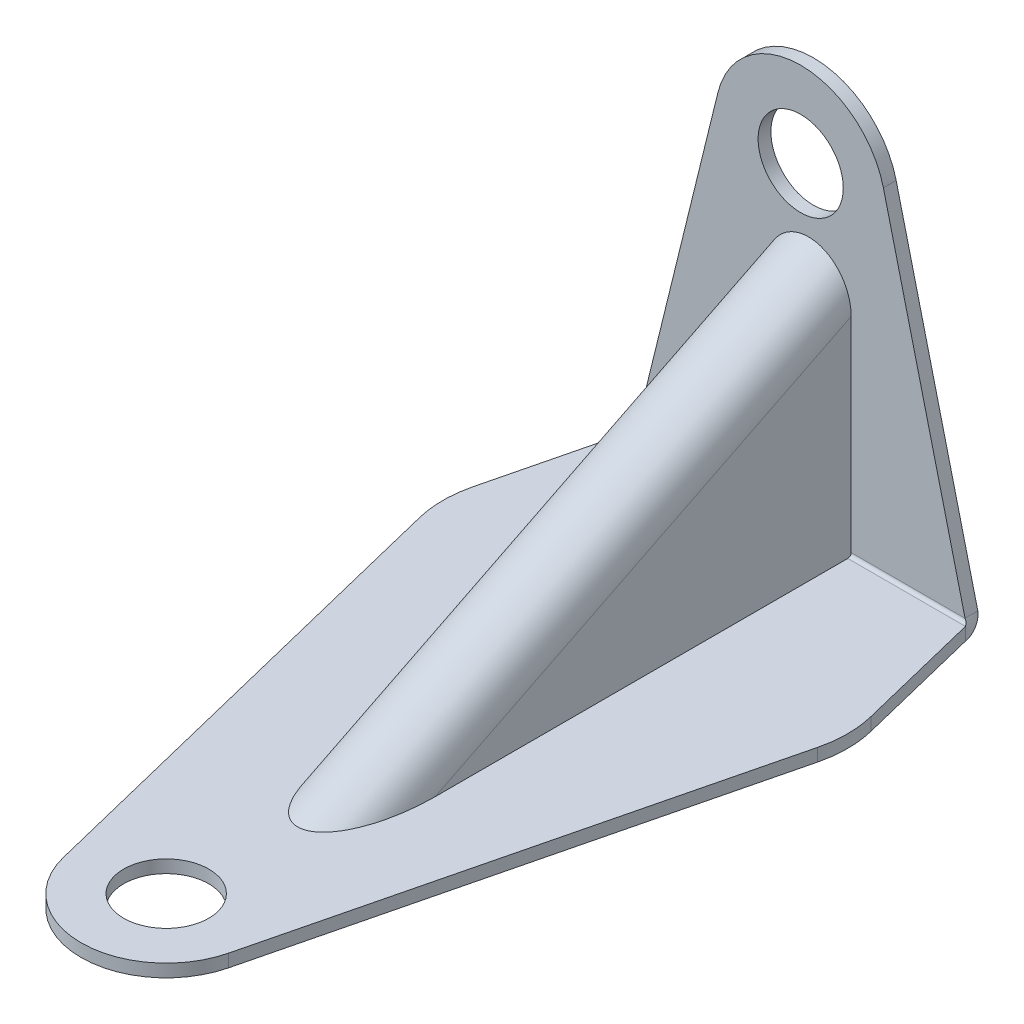
ISO-10303-21;
HEADER;
FILE_DESCRIPTION(('STEP AP214'),'2;1');
FILE_NAME('part.step','',(''),(''),'','','');
FILE_SCHEMA(('AUTOMOTIVE_DESIGN { 1 0 10303 214 1 1 1 1 }'));
ENDSEC;
DATA;
#1=APPLICATION_CONTEXT('core data for automotive mechanical design processes');
#2=APPLICATION_PROTOCOL_DEFINITION('international standard','automotive_design',2000,#1);
#3=PRODUCT_CONTEXT('',#1,'mechanical');
#4=PRODUCT('Part','Part','',(#3));
#5=PRODUCT_RELATED_PRODUCT_CATEGORY('part','',(#4));
#6=PRODUCT_DEFINITION_FORMATION('','',#4);
#7=PRODUCT_DEFINITION_CONTEXT('part definition',#1,'design');
#8=PRODUCT_DEFINITION('design','',#6,#7);
#9=PRODUCT_DEFINITION_SHAPE('','',#8);
#10=(LENGTH_UNIT() NAMED_UNIT(*) SI_UNIT(.MILLI.,.METRE.));
#11=(NAMED_UNIT(*) PLANE_ANGLE_UNIT() SI_UNIT($,.RADIAN.));
#12=(NAMED_UNIT(*) SI_UNIT($,.STERADIAN.) SOLID_ANGLE_UNIT());
#13=UNCERTAINTY_MEASURE_WITH_UNIT(LENGTH_MEASURE(1.E-05),#10,'distance_accuracy_value','');
#14=(GEOMETRIC_REPRESENTATION_CONTEXT(3) GLOBAL_UNCERTAINTY_ASSIGNED_CONTEXT((#13)) GLOBAL_UNIT_ASSIGNED_CONTEXT((#10,
#11,#12)) REPRESENTATION_CONTEXT('',''));
#15=CARTESIAN_POINT('',(0.,0.,0.));
#16=DIRECTION('',(0.,0.,1.));
#17=DIRECTION('',(1.,0.,0.));
#18=AXIS2_PLACEMENT_3D('',#15,#16,#17);
#19=CARTESIAN_POINT('',(0.,-35.5064157758141,-39.493584224186));
#20=DIRECTION('',(0.,0.,1.));
#21=DIRECTION('',(0.,-1.,0.));
#22=AXIS2_PLACEMENT_3D('',#19,#20,#21);
#23=PLANE('',#22);
#24=CARTESIAN_POINT('',(0.,76.9935842241859,-39.4935842241856));
#25=DIRECTION('',(0.,0.,1.));
#26=DIRECTION('',(0.,-1.,0.));
#27=AXIS2_PLACEMENT_3D('',#24,#25,#26);
#28=CIRCLE('',#27,10.);
#29=CARTESIAN_POINT('',(0.,66.9935842241859,-39.4935842241857));
#30=VERTEX_POINT('',#29);
#31=EDGE_CURVE('E598',#30,#30,#28,.F.);
#32=ORIENTED_EDGE('',*,*,#31,.F.);
#33=EDGE_LOOP('',(#32));
#34=FACE_BOUND('',#33,.T.);
#35=DIRECTION('',(0.,-1.,0.));
#36=VECTOR('',#35,1.);
#37=CARTESIAN_POINT('',(8.86383123235212,-35.5064157758141,-39.493584224186));
#38=LINE('',#37,#36);
#39=CARTESIAN_POINT('',(8.86383123235212,53.3196601125012,-39.4935842241857));
#40=VERTEX_POINT('',#39);
#41=CARTESIAN_POINT('',(8.86383123235213,3.80000000000002,-39.4935842241859));
#42=VERTEX_POINT('',#41);
#43=EDGE_CURVE('E228',#40,#42,#38,.T.);
#44=ORIENTED_EDGE('',*,*,#43,.F.);
#45=CARTESIAN_POINT('',(1.86383123235212,53.3196601125012,-39.4935842241857));
#46=DIRECTION('',(0.,0.,1.));
#47=DIRECTION('',(0.,-1.,0.));
#48=AXIS2_PLACEMENT_3D('',#45,#46,#47);
#49=ELLIPSE('',#48,7.82623792124925,7.);
#50=CARTESIAN_POINT('',(-5.13616876764788,53.3196601125012,-39.4935842241857));
#51=VERTEX_POINT('',#50);
#52=EDGE_CURVE('E230',#40,#51,#49,.T.);
#53=ORIENTED_EDGE('',*,*,#52,.T.);
#54=DIRECTION('',(0.,-1.,0.));
#55=VECTOR('',#54,1.);
#56=CARTESIAN_POINT('',(-5.13616876764788,-35.5064157758141,-39.493584224186));
#57=LINE('',#56,#55);
#58=CARTESIAN_POINT('',(-5.13616876764789,3.80000000000002,-39.4935842241859));
#59=VERTEX_POINT('',#58);
#60=EDGE_CURVE('E216',#51,#59,#57,.T.);
#61=ORIENTED_EDGE('',*,*,#60,.T.);
#62=DIRECTION('',(-1.,0.,0.));
#63=VECTOR('',#62,1.);
#64=CARTESIAN_POINT('',(0.,3.80000000000002,-39.4935842241859));
#65=LINE('',#64,#63);
#66=CARTESIAN_POINT('',(-38.6038312323521,3.80000000000002,-39.4935842241859));
#67=VERTEX_POINT('',#66);
#68=EDGE_CURVE('E429',#59,#67,#65,.T.);
#69=ORIENTED_EDGE('',*,*,#68,.T.);
#70=DIRECTION('',(-0.238900945490863,-0.971043942488481,0.));
#71=VECTOR('',#70,1.);
#72=CARTESIAN_POINT('',(-19.4208788497696,81.7716031340032,-39.4935842241856));
#73=LINE('',#72,#71);
#74=CARTESIAN_POINT('',(-19.4208788497696,81.7716031340032,-39.4935842241856));
#75=VERTEX_POINT('',#74);
#76=EDGE_CURVE('E518',#75,#67,#73,.T.);
#77=ORIENTED_EDGE('',*,*,#76,.F.);
#78=CARTESIAN_POINT('',(0.,76.9935842241859,-39.4935842241856));
#79=DIRECTION('',(0.,0.,1.));
#80=DIRECTION('',(0.,-1.,0.));
#81=AXIS2_PLACEMENT_3D('',#78,#79,#80);
#82=CIRCLE('',#81,20.);
#83=CARTESIAN_POINT('',(19.4208788497696,81.7716031340032,-39.4935842241856));
#84=VERTEX_POINT('',#83);
#85=EDGE_CURVE('E537',#84,#75,#82,.T.);
#86=ORIENTED_EDGE('',*,*,#85,.F.);
#87=DIRECTION('',(-0.238900945490863,0.971043942488481,0.));
#88=VECTOR('',#87,1.);
#89=CARTESIAN_POINT('',(19.4208788497696,81.7716031340032,-39.4935842241856));
#90=LINE('',#89,#88);
#91=CARTESIAN_POINT('',(38.6038312323521,3.80000000000002,-39.4935842241859));
#92=VERTEX_POINT('',#91);
#93=EDGE_CURVE('E534',#92,#84,#90,.T.);
#94=ORIENTED_EDGE('',*,*,#93,.F.);
#95=EDGE_CURVE('E447',#92,#42,#65,.T.);
#96=ORIENTED_EDGE('',*,*,#95,.T.);
#97=EDGE_LOOP('',(#44,#53,#61,#69,#77,#86,#94,#96));
#98=FACE_BOUND('',#97,.T.);
#99=ADVANCED_FACE('F68',(#34,#98),#23,.F.);
#100=CARTESIAN_POINT('',(0.,0.,0.));
#101=DIRECTION('',(0.,1.,0.));
#102=DIRECTION('',(0.,0.,1.));
#103=AXIS2_PLACEMENT_3D('',#100,#101,#102);
#104=PLANE('',#103);
#105=CARTESIAN_POINT('',(0.,0.,112.5));
#106=DIRECTION('',(0.,1.,0.));
#107=DIRECTION('',(0.,0.,1.));
#108=AXIS2_PLACEMENT_3D('',#105,#106,#107);
#109=CIRCLE('',#108,10.);
#110=CARTESIAN_POINT('',(0.,0.,122.5));
#111=VERTEX_POINT('',#110);
#112=EDGE_CURVE('E891',#111,#111,#109,.F.);
#113=ORIENTED_EDGE('',*,*,#112,.F.);
#114=EDGE_LOOP('',(#113));
#115=FACE_BOUND('',#114,.T.);
#116=DIRECTION('',(0.,0.,1.));
#117=VECTOR('',#116,1.);
#118=CARTESIAN_POINT('',(8.86383123235212,0.,0.));
#119=LINE('',#118,#117);
#120=CARTESIAN_POINT('',(8.86383123235213,0.,-35.6935842241859));
#121=VERTEX_POINT('',#120);
#122=CARTESIAN_POINT('',(8.86383123235212,0.,67.1457360008163));
#123=VERTEX_POINT('',#122);
#124=EDGE_CURVE('E223',#121,#123,#119,.T.);
#125=ORIENTED_EDGE('',*,*,#124,.F.);
#126=DIRECTION('',(-1.,0.,0.));
#127=VECTOR('',#126,1.);
#128=CARTESIAN_POINT('',(0.,0.,-35.6935842241859));
#129=LINE('',#128,#127);
#130=CARTESIAN_POINT('',(39.4926775922515,0.,-35.6935842241859));
#131=VERTEX_POINT('',#130);
#132=EDGE_CURVE('E412',#131,#121,#129,.T.);
#133=ORIENTED_EDGE('',*,*,#132,.F.);
#134=DIRECTION('',(-0.238900945490863,0.,-0.971043942488481));
#135=VECTOR('',#134,1.);
#136=CARTESIAN_POINT('',(19.4208788497696,0.,-117.278018909817));
#137=LINE('',#136,#135);
#138=CARTESIAN_POINT('',(46.7382293549642,0.,-6.24309739286439));
#139=VERTEX_POINT('',#138);
#140=EDGE_CURVE('E538',#139,#131,#137,.T.);
#141=ORIENTED_EDGE('',*,*,#140,.F.);
#142=CARTESIAN_POINT('',(0.,0.,0.));
#143=DIRECTION('',(0.,1.,0.));
#144=DIRECTION('',(1.,0.,0.));
#145=AXIS2_PLACEMENT_3D('',#142,#143,#144);
#146=ELLIPSE('',#145,47.5,35.);
#147=CARTESIAN_POINT('',(46.7382293549642,0.,6.24309739286439));
#148=VERTEX_POINT('',#147);
#149=EDGE_CURVE('E479',#148,#139,#146,.T.);
#150=ORIENTED_EDGE('',*,*,#149,.F.);
#151=DIRECTION('',(0.238900945490864,0.,-0.97104394248848));
#152=VECTOR('',#151,1.);
#153=CARTESIAN_POINT('',(19.4208788497696,0.,117.278018909817));
#154=LINE('',#153,#152);
#155=CARTESIAN_POINT('',(19.4208788497696,0.,117.278018909817));
#156=VERTEX_POINT('',#155);
#157=EDGE_CURVE('E487',#156,#148,#154,.T.);
#158=ORIENTED_EDGE('',*,*,#157,.F.);
#159=CARTESIAN_POINT('',(0.,0.,112.5));
#160=DIRECTION('',(0.,1.,0.));
#161=DIRECTION('',(0.,0.,1.));
#162=AXIS2_PLACEMENT_3D('',#159,#160,#161);
#163=CIRCLE('',#162,20.);
#164=CARTESIAN_POINT('',(-19.4208788497697,0.,117.278018909817));
#165=VERTEX_POINT('',#164);
#166=EDGE_CURVE('E613',#165,#156,#163,.T.);
#167=ORIENTED_EDGE('',*,*,#166,.F.);
#168=DIRECTION('',(0.238900945490862,0.,0.971043942488481));
#169=VECTOR('',#168,1.);
#170=CARTESIAN_POINT('',(-19.4208788497697,0.,117.278018909817));
#171=LINE('',#170,#169);
#172=CARTESIAN_POINT('',(-46.7382293549642,0.,6.24309739286432));
#173=VERTEX_POINT('',#172);
#174=EDGE_CURVE('E628',#173,#165,#171,.T.);
#175=ORIENTED_EDGE('',*,*,#174,.F.);
#176=CARTESIAN_POINT('',(0.,0.,0.));
#177=DIRECTION('',(0.,1.,0.));
#178=DIRECTION('',(1.,0.,0.));
#179=AXIS2_PLACEMENT_3D('',#176,#177,#178);
#180=ELLIPSE('',#179,47.5,35.);
#181=CARTESIAN_POINT('',(-46.7382293549642,0.,-6.24309739286437));
#182=VERTEX_POINT('',#181);
#183=EDGE_CURVE('E603',#182,#173,#180,.T.);
#184=ORIENTED_EDGE('',*,*,#183,.F.);
#185=DIRECTION('',(-0.238900945490863,0.,0.971043942488481));
#186=VECTOR('',#185,1.);
#187=CARTESIAN_POINT('',(-19.4208788497696,0.,-117.278018909817));
#188=LINE('',#187,#186);
#189=CARTESIAN_POINT('',(-39.4926775922515,0.,-35.6935842241859));
#190=VERTEX_POINT('',#189);
#191=EDGE_CURVE('E376',#190,#182,#188,.T.);
#192=ORIENTED_EDGE('',*,*,#191,.F.);
#193=CARTESIAN_POINT('',(-5.13616876764789,0.,-35.6935842241859));
#194=VERTEX_POINT('',#193);
#195=EDGE_CURVE('E221',#194,#190,#129,.T.);
#196=ORIENTED_EDGE('',*,*,#195,.F.);
#197=DIRECTION('',(0.,0.,1.));
#198=VECTOR('',#197,1.);
#199=CARTESIAN_POINT('',(-5.13616876764788,0.,0.));
#200=LINE('',#199,#198);
#201=CARTESIAN_POINT('',(-5.13616876764788,0.,67.1457360008163));
#202=VERTEX_POINT('',#201);
#203=EDGE_CURVE('E84',#194,#202,#200,.T.);
#204=ORIENTED_EDGE('',*,*,#203,.T.);
#205=CARTESIAN_POINT('',(1.86383123235212,0.,67.1457360008163));
#206=DIRECTION('',(0.,1.,0.));
#207=DIRECTION('',(0.,0.,1.));
#208=AXIS2_PLACEMENT_3D('',#205,#206,#207);
#209=ELLIPSE('',#208,15.6524758424985,7.);
#210=EDGE_CURVE('E13',#202,#123,#209,.T.);
#211=ORIENTED_EDGE('',*,*,#210,.T.);
#212=EDGE_LOOP('',(#125,#133,#141,#150,#158,#167,#175,#184,#192,#196,#204,#211));
#213=FACE_BOUND('',#212,.T.);
#214=ADVANCED_FACE('F219',(#115,#213),#104,.F.);
#215=CARTESIAN_POINT('',(79.1248310294722,3.8,-35.6935842241859));
#216=DIRECTION('',(-1.,0.,0.));
#217=DIRECTION('',(0.,0.,1.));
#218=AXIS2_PLACEMENT_3D('',#215,#216,#217);
#219=CYLINDRICAL_SURFACE('',#218,3.8);
#220=CARTESIAN_POINT('',(8.86383123235213,3.8,-35.6935842241859));
#221=DIRECTION('',(-1.,0.,0.));
#222=DIRECTION('',(0.,0.,1.));
#223=AXIS2_PLACEMENT_3D('',#220,#221,#222);
#224=CIRCLE('',#223,3.8);
#225=EDGE_CURVE('E77',#42,#121,#224,.T.);
#226=ORIENTED_EDGE('',*,*,#225,.F.);
#227=ORIENTED_EDGE('',*,*,#95,.F.);
#228=CARTESIAN_POINT('',(39.4926775922515,0.,-35.6935842241858));
#229=CARTESIAN_POINT('',(39.4185939972501,0.,-36.1910907987583));
#230=CARTESIAN_POINT('',(39.3445365322683,0.0989038286603866,-36.6882261847511));
#231=CARTESIAN_POINT('',(39.196395472285,0.4796117242538,-37.6073363495953));
#232=CARTESIAN_POINT('',(39.1223249422934,0.76126599888689,-38.0288617600905));
#233=CARTESIAN_POINT('',(38.9741838823102,1.4647224640953,-38.732318225299));
#234=CARTESIAN_POINT('',(38.9001133523186,1.88624787459057,-39.0139724999321));
#235=CARTESIAN_POINT('',(38.7519722923354,2.80535803943473,-39.3946803955255));
#236=CARTESIAN_POINT('',(38.6779148273535,3.30249342542754,-39.4935842241859));
#237=CARTESIAN_POINT('',(38.6038312323521,3.80000000000001,-39.4935842241859));
#238=B_SPLINE_CURVE_WITH_KNOTS('',3,(#228,#229,#230,#231,#232,#233,#234,#235,#236,#237),
.UNSPECIFIED.,.F.,.F.,(4,2,2,2,4),(0.,0.25,0.5,0.75,1.),.UNSPECIFIED.);
#239=EDGE_CURVE('E257',#131,#92,#238,.T.);
#240=ORIENTED_EDGE('',*,*,#239,.F.);
#241=ORIENTED_EDGE('',*,*,#132,.T.);
#242=EDGE_LOOP('',(#226,#227,#240,#241));
#243=FACE_BOUND('',#242,.T.);
#244=ADVANCED_FACE('F445',(#243),#219,.T.);
#245=CARTESIAN_POINT('',(0.,-35.5064157758141,-36.493584224186));
#246=DIRECTION('',(0.,0.,1.));
#247=DIRECTION('',(0.,-1.,0.));
#248=AXIS2_PLACEMENT_3D('',#245,#246,#247);
#249=PLANE('',#248);
#250=CARTESIAN_POINT('',(0.,76.9935842241859,-36.4935842241859));
#251=DIRECTION('',(0.,0.,1.));
#252=DIRECTION('',(1.,0.,0.));
#253=AXIS2_PLACEMENT_3D('',#250,#251,#252);
#254=CIRCLE('',#253,10.);
#255=CARTESIAN_POINT('',(10.,76.9935842241859,-36.4935842241859));
#256=VERTEX_POINT('',#255);
#257=EDGE_CURVE('E887',#256,#256,#254,.T.);
#258=ORIENTED_EDGE('',*,*,#257,.F.);
#259=EDGE_LOOP('',(#258));
#260=FACE_BOUND('',#259,.T.);
#261=CARTESIAN_POINT('',(1.86383123235212,51.8196601125012,-36.4935842241857));
#262=DIRECTION('',(0.,0.,1.));
#263=DIRECTION('',(0.,-1.,0.));
#264=AXIS2_PLACEMENT_3D('',#261,#262,#263);
#265=ELLIPSE('',#264,11.1803398874989,10.);
#266=CARTESIAN_POINT('',(11.8638312323521,51.8196601125012,-36.4935842241857));
#267=VERTEX_POINT('',#266);
#268=CARTESIAN_POINT('',(-8.13616876764788,51.8196601125012,-36.4935842241857));
#269=VERTEX_POINT('',#268);
#270=EDGE_CURVE('E92',#267,#269,#265,.T.);
#271=ORIENTED_EDGE('',*,*,#270,.F.);
#272=DIRECTION('',(0.,-1.,0.));
#273=VECTOR('',#272,1.);
#274=CARTESIAN_POINT('',(11.8638312323521,-35.5064157758141,-36.493584224186));
#275=LINE('',#274,#273);
#276=CARTESIAN_POINT('',(11.8638312323521,3.8,-36.4935842241859));
#277=VERTEX_POINT('',#276);
#278=EDGE_CURVE('E251',#267,#277,#275,.T.);
#279=ORIENTED_EDGE('',*,*,#278,.T.);
#280=DIRECTION('',(-1.,0.,0.));
#281=VECTOR('',#280,1.);
#282=CARTESIAN_POINT('',(0.,3.8,-36.4935842241859));
#283=LINE('',#282,#281);
#284=CARTESIAN_POINT('',(38.6038312323521,3.8,-36.4935842241859));
#285=VERTEX_POINT('',#284);
#286=EDGE_CURVE('E504',#285,#277,#283,.T.);
#287=ORIENTED_EDGE('',*,*,#286,.F.);
#288=DIRECTION('',(-0.238900945490863,0.971043942488481,0.));
#289=VECTOR('',#288,1.);
#290=CARTESIAN_POINT('',(19.4208788497696,81.7716031340031,-36.4935842241856));
#291=LINE('',#290,#289);
#292=CARTESIAN_POINT('',(19.4208788497696,81.7716031340031,-36.4935842241856));
#293=VERTEX_POINT('',#292);
#294=EDGE_CURVE('E514',#285,#293,#291,.T.);
#295=ORIENTED_EDGE('',*,*,#294,.T.);
#296=CARTESIAN_POINT('',(0.,76.9935842241859,-36.4935842241856));
#297=DIRECTION('',(0.,0.,1.));
#298=DIRECTION('',(0.,-1.,0.));
#299=AXIS2_PLACEMENT_3D('',#296,#297,#298);
#300=CIRCLE('',#299,20.);
#301=CARTESIAN_POINT('',(-19.4208788497696,81.7716031340032,-36.4935842241856));
#302=VERTEX_POINT('',#301);
#303=EDGE_CURVE('E517',#293,#302,#300,.T.);
#304=ORIENTED_EDGE('',*,*,#303,.T.);
#305=DIRECTION('',(-0.238900945490863,-0.971043942488481,0.));
#306=VECTOR('',#305,1.);
#307=CARTESIAN_POINT('',(-19.4208788497696,81.7716031340031,-36.4935842241856));
#308=LINE('',#307,#306);
#309=CARTESIAN_POINT('',(-38.6038312323521,3.8,-36.4935842241859));
#310=VERTEX_POINT('',#309);
#311=EDGE_CURVE('E549',#302,#310,#308,.T.);
#312=ORIENTED_EDGE('',*,*,#311,.T.);
#313=CARTESIAN_POINT('',(-8.13616876764788,3.8,-36.4935842241859));
#314=VERTEX_POINT('',#313);
#315=EDGE_CURVE('E501',#314,#310,#283,.T.);
#316=ORIENTED_EDGE('',*,*,#315,.F.);
#317=DIRECTION('',(0.,-1.,0.));
#318=VECTOR('',#317,1.);
#319=CARTESIAN_POINT('',(-8.13616876764788,-35.5064157758141,-36.493584224186));
#320=LINE('',#319,#318);
#321=EDGE_CURVE('E244',#269,#314,#320,.T.);
#322=ORIENTED_EDGE('',*,*,#321,.F.);
#323=EDGE_LOOP('',(#271,#279,#287,#295,#304,#312,#316,#322));
#324=FACE_BOUND('',#323,.T.);
#325=ADVANCED_FACE('F397',(#260,#324),#249,.T.);
#326=CARTESIAN_POINT('',(0.,3.,0.));
#327=DIRECTION('',(0.,1.,0.));
#328=DIRECTION('',(0.,0.,1.));
#329=AXIS2_PLACEMENT_3D('',#326,#327,#328);
#330=PLANE('',#329);
#331=CARTESIAN_POINT('',(0.,3.,112.5));
#332=DIRECTION('',(0.,1.,0.));
#333=DIRECTION('',(0.,0.,1.));
#334=AXIS2_PLACEMENT_3D('',#331,#332,#333);
#335=CIRCLE('',#334,10.);
#336=CARTESIAN_POINT('',(0.,3.,122.5));
#337=VERTEX_POINT('',#336);
#338=EDGE_CURVE('E888',#337,#337,#335,.T.);
#339=ORIENTED_EDGE('',*,*,#338,.F.);
#340=EDGE_LOOP('',(#339));
#341=FACE_BOUND('',#340,.T.);
#342=DIRECTION('',(-1.,0.,0.));
#343=VECTOR('',#342,1.);
#344=CARTESIAN_POINT('',(0.,3.,-35.6935842241859));
#345=LINE('',#344,#343);
#346=CARTESIAN_POINT('',(39.4926775922515,3.,-35.6935842241859));
#347=VERTEX_POINT('',#346);
#348=CARTESIAN_POINT('',(11.8638312323521,3.,-35.6935842241859));
#349=VERTEX_POINT('',#348);
#350=EDGE_CURVE('E492',#347,#349,#345,.T.);
#351=ORIENTED_EDGE('',*,*,#350,.T.);
#352=DIRECTION('',(0.,0.,1.));
#353=VECTOR('',#352,1.);
#354=CARTESIAN_POINT('',(11.8638312323521,3.,0.));
#355=LINE('',#354,#353);
#356=CARTESIAN_POINT('',(11.8638312323521,3.,61.1457360008163));
#357=VERTEX_POINT('',#356);
#358=EDGE_CURVE('E249',#349,#357,#355,.T.);
#359=ORIENTED_EDGE('',*,*,#358,.T.);
#360=CARTESIAN_POINT('',(1.86383123235212,3.,61.1457360008163));
#361=DIRECTION('',(0.,1.,0.));
#362=DIRECTION('',(0.,0.,1.));
#363=AXIS2_PLACEMENT_3D('',#360,#361,#362);
#364=ELLIPSE('',#363,22.3606797749978,10.);
#365=CARTESIAN_POINT('',(-8.13616876764788,3.,61.1457360008163));
#366=VERTEX_POINT('',#365);
#367=EDGE_CURVE('E253',#366,#357,#364,.T.);
#368=ORIENTED_EDGE('',*,*,#367,.F.);
#369=DIRECTION('',(0.,0.,1.));
#370=VECTOR('',#369,1.);
#371=CARTESIAN_POINT('',(-8.13616876764788,3.,0.));
#372=LINE('',#371,#370);
#373=CARTESIAN_POINT('',(-8.13616876764788,3.,-35.6935842241859));
#374=VERTEX_POINT('',#373);
#375=EDGE_CURVE('E241',#374,#366,#372,.T.);
#376=ORIENTED_EDGE('',*,*,#375,.F.);
#377=CARTESIAN_POINT('',(-39.4926775922515,3.,-35.6935842241859));
#378=VERTEX_POINT('',#377);
#379=EDGE_CURVE('E496',#374,#378,#345,.T.);
#380=ORIENTED_EDGE('',*,*,#379,.T.);
#381=DIRECTION('',(-0.238900945490863,0.,0.971043942488481));
#382=VECTOR('',#381,1.);
#383=CARTESIAN_POINT('',(-19.4208788497696,3.,-117.278018909817));
#384=LINE('',#383,#382);
#385=CARTESIAN_POINT('',(-46.7382293549642,3.,-6.24309739286437));
#386=VERTEX_POINT('',#385);
#387=EDGE_CURVE('E382',#378,#386,#384,.T.);
#388=ORIENTED_EDGE('',*,*,#387,.T.);
#389=CARTESIAN_POINT('',(0.,3.,0.));
#390=DIRECTION('',(0.,1.,0.));
#391=DIRECTION('',(1.,0.,0.));
#392=AXIS2_PLACEMENT_3D('',#389,#390,#391);
#393=ELLIPSE('',#392,47.5,35.);
#394=CARTESIAN_POINT('',(-46.7382293549642,3.,6.24309739286432));
#395=VERTEX_POINT('',#394);
#396=EDGE_CURVE('E378',#386,#395,#393,.T.);
#397=ORIENTED_EDGE('',*,*,#396,.T.);
#398=DIRECTION('',(0.238900945490862,0.,0.971043942488481));
#399=VECTOR('',#398,1.);
#400=CARTESIAN_POINT('',(-19.4208788497697,3.,117.278018909817));
#401=LINE('',#400,#399);
#402=CARTESIAN_POINT('',(-19.4208788497697,3.,117.278018909817));
#403=VERTEX_POINT('',#402);
#404=EDGE_CURVE('E381',#395,#403,#401,.T.);
#405=ORIENTED_EDGE('',*,*,#404,.T.);
#406=CARTESIAN_POINT('',(0.,3.,112.5));
#407=DIRECTION('',(0.,1.,0.));
#408=DIRECTION('',(0.,0.,1.));
#409=AXIS2_PLACEMENT_3D('',#406,#407,#408);
#410=CIRCLE('',#409,20.);
#411=CARTESIAN_POINT('',(19.4208788497696,3.,117.278018909817));
#412=VERTEX_POINT('',#411);
#413=EDGE_CURVE('E638',#403,#412,#410,.T.);
#414=ORIENTED_EDGE('',*,*,#413,.T.);
#415=DIRECTION('',(0.238900945490864,0.,-0.97104394248848));
#416=VECTOR('',#415,1.);
#417=CARTESIAN_POINT('',(19.4208788497696,3.,117.278018909817));
#418=LINE('',#417,#416);
#419=CARTESIAN_POINT('',(46.7382293549642,3.,6.24309739286439));
#420=VERTEX_POINT('',#419);
#421=EDGE_CURVE('E377',#412,#420,#418,.T.);
#422=ORIENTED_EDGE('',*,*,#421,.T.);
#423=CARTESIAN_POINT('',(0.,3.,0.));
#424=DIRECTION('',(0.,1.,0.));
#425=DIRECTION('',(1.,0.,0.));
#426=AXIS2_PLACEMENT_3D('',#423,#424,#425);
#427=ELLIPSE('',#426,47.5,35.);
#428=CARTESIAN_POINT('',(46.7382293549642,3.,-6.24309739286439));
#429=VERTEX_POINT('',#428);
#430=EDGE_CURVE('E368',#420,#429,#427,.T.);
#431=ORIENTED_EDGE('',*,*,#430,.T.);
#432=DIRECTION('',(-0.238900945490863,0.,-0.971043942488481));
#433=VECTOR('',#432,1.);
#434=CARTESIAN_POINT('',(19.4208788497696,3.,-117.278018909817));
#435=LINE('',#434,#433);
#436=EDGE_CURVE('E500',#429,#347,#435,.T.);
#437=ORIENTED_EDGE('',*,*,#436,.T.);
#438=EDGE_LOOP('',(#351,#359,#368,#376,#380,#388,#397,#405,#414,#422,#431,#437));
#439=FACE_BOUND('',#438,.T.);
#440=ADVANCED_FACE('F394',(#341,#439),#330,.T.);
#441=CARTESIAN_POINT('',(79.1248310294722,3.8,-35.6935842241859));
#442=DIRECTION('',(-1.,0.,0.));
#443=DIRECTION('',(0.,0.,1.));
#444=AXIS2_PLACEMENT_3D('',#441,#442,#443);
#445=CYLINDRICAL_SURFACE('',#444,0.8);
#446=ORIENTED_EDGE('',*,*,#286,.T.);
#447=CARTESIAN_POINT('',(11.8638312323521,3.8,-35.6935842241859));
#448=DIRECTION('',(-1.,0.,0.));
#449=DIRECTION('',(0.,0.,1.));
#450=AXIS2_PLACEMENT_3D('',#447,#448,#449);
#451=CIRCLE('',#450,0.8);
#452=EDGE_CURVE('E247',#277,#349,#451,.T.);
#453=ORIENTED_EDGE('',*,*,#452,.T.);
#454=ORIENTED_EDGE('',*,*,#350,.F.);
#455=CARTESIAN_POINT('',(38.6038312323521,3.8,-36.4935842241859));
#456=CARTESIAN_POINT('',(38.6779106636851,3.69526766030339,-36.4935842241859));
#457=CARTESIAN_POINT('',(38.7519722923354,3.59060169251258,-36.4727623655205));
#458=CARTESIAN_POINT('',(38.9001133523186,3.39710481570328,-36.3926133348693));
#459=CARTESIAN_POINT('',(38.9741838823102,3.30836262402006,-36.3333176981044));
#460=CARTESIAN_POINT('',(39.1223249422934,3.16026652608145,-36.1852216001658));
#461=CARTESIAN_POINT('',(39.196395472285,3.10097088931659,-36.0964794084826));
#462=CARTESIAN_POINT('',(39.3445365322683,3.02082185866534,-35.9029825316733));
#463=CARTESIAN_POINT('',(39.4185981609185,3.,-35.7983165638825));
#464=CARTESIAN_POINT('',(39.4926775922515,3.,-35.6935842241859));
#465=B_SPLINE_CURVE_WITH_KNOTS('',3,(#455,#456,#457,#458,#459,#460,#461,#462,#463,#464),
.UNSPECIFIED.,.F.,.F.,(4,2,2,2,4),(0.,0.25,0.5,0.75,1.),.UNSPECIFIED.);
#466=EDGE_CURVE('E461',#347,#285,#465,.F.);
#467=ORIENTED_EDGE('',*,*,#466,.T.);
#468=EDGE_LOOP('',(#446,#453,#454,#467));
#469=FACE_BOUND('',#468,.T.);
#470=ADVANCED_FACE('F277',(#469),#445,.F.);
#471=CARTESIAN_POINT('',(-19.4208788497696,81.7716031340031,-36.4935842241856));
#472=DIRECTION('',(0.971043942488481,-0.238900945490863,0.));
#473=DIRECTION('',(0.238900945490863,0.971043942488481,0.));
#474=AXIS2_PLACEMENT_3D('',#471,#472,#473);
#475=PLANE('',#474);
#476=ORIENTED_EDGE('',*,*,#76,.T.);
#477=CARTESIAN_POINT('',(-38.6038312323521,3.8,-36.4935842241859));
#478=CARTESIAN_POINT('',(-38.6038312323521,3.80000000000001,-39.4935842241859));
#479=B_SPLINE_CURVE_WITH_KNOTS('',1,(#477,#478),.UNSPECIFIED.,.F.,.F.,(2,2),(0.,1.),.UNSPECIFIED.);
#480=EDGE_CURVE('E365',#67,#310,#479,.F.);
#481=ORIENTED_EDGE('',*,*,#480,.T.);
#482=ORIENTED_EDGE('',*,*,#311,.F.);
#483=DIRECTION('',(0.,0.,-1.));
#484=VECTOR('',#483,1.);
#485=CARTESIAN_POINT('',(-19.4208788497696,81.7716031340032,-36.4935842241856));
#486=LINE('',#485,#484);
#487=EDGE_CURVE('E554',#302,#75,#486,.T.);
#488=ORIENTED_EDGE('',*,*,#487,.T.);
#489=EDGE_LOOP('',(#476,#481,#482,#488));
#490=FACE_BOUND('',#489,.T.);
#491=ADVANCED_FACE('F547',(#490),#475,.F.);
#492=CARTESIAN_POINT('',(19.4208788497696,81.7716031340031,-36.4935842241856));
#493=DIRECTION('',(-0.971043942488481,-0.238900945490863,0.));
#494=DIRECTION('',(0.238900945490863,-0.971043942488481,0.));
#495=AXIS2_PLACEMENT_3D('',#492,#493,#494);
#496=PLANE('',#495);
#497=ORIENTED_EDGE('',*,*,#294,.F.);
#498=CARTESIAN_POINT('',(38.6038312323521,3.80000000000001,-39.4935842241859));
#499=CARTESIAN_POINT('',(38.6038312323521,3.8,-36.4935842241859));
#500=B_SPLINE_CURVE_WITH_KNOTS('',1,(#498,#499),.UNSPECIFIED.,.F.,.F.,(2,2),(0.,1.),.UNSPECIFIED.);
#501=EDGE_CURVE('E433',#285,#92,#500,.F.);
#502=ORIENTED_EDGE('',*,*,#501,.T.);
#503=ORIENTED_EDGE('',*,*,#93,.T.);
#504=DIRECTION('',(0.,0.,-1.));
#505=VECTOR('',#504,1.);
#506=CARTESIAN_POINT('',(19.4208788497696,81.7716031340031,-36.4935842241856));
#507=LINE('',#506,#505);
#508=EDGE_CURVE('E505',#293,#84,#507,.T.);
#509=ORIENTED_EDGE('',*,*,#508,.F.);
#510=EDGE_LOOP('',(#497,#502,#503,#509));
#511=FACE_BOUND('',#510,.T.);
#512=ADVANCED_FACE('F70',(#511),#496,.F.);
#513=CARTESIAN_POINT('',(0.,76.9935842241859,-36.4935842241856));
#514=DIRECTION('',(0.,0.,-1.));
#515=DIRECTION('',(0.,1.,0.));
#516=AXIS2_PLACEMENT_3D('',#513,#514,#515);
#517=CYLINDRICAL_SURFACE('',#516,20.);
#518=ORIENTED_EDGE('',*,*,#85,.T.);
#519=ORIENTED_EDGE('',*,*,#487,.F.);
#520=ORIENTED_EDGE('',*,*,#303,.F.);
#521=ORIENTED_EDGE('',*,*,#508,.T.);
#522=EDGE_LOOP('',(#518,#519,#520,#521));
#523=FACE_BOUND('',#522,.T.);
#524=ADVANCED_FACE('F580',(#523),#517,.T.);
#525=DIRECTION('',(0.,-1.,0.));
#526=VECTOR('',#525,1.);
#527=SURFACE_OF_LINEAR_EXTRUSION('',#427,#526);
#528=ORIENTED_EDGE('',*,*,#149,.T.);
#529=DIRECTION('',(0.,-1.,0.));
#530=VECTOR('',#529,1.);
#531=CARTESIAN_POINT('',(46.7382293549642,3.,-6.24309739286439));
#532=LINE('',#531,#530);
#533=EDGE_CURVE('E383',#429,#139,#532,.T.);
#534=ORIENTED_EDGE('',*,*,#533,.F.);
#535=ORIENTED_EDGE('',*,*,#430,.F.);
#536=DIRECTION('',(0.,-1.,0.));
#537=VECTOR('',#536,1.);
#538=CARTESIAN_POINT('',(46.7382293549642,3.,6.24309739286439));
#539=LINE('',#538,#537);
#540=EDGE_CURVE('E480',#420,#148,#539,.T.);
#541=ORIENTED_EDGE('',*,*,#540,.T.);
#542=EDGE_LOOP('',(#528,#534,#535,#541));
#543=FACE_BOUND('',#542,.T.);
#544=ADVANCED_FACE('F338',(#543),#527,.F.);
#545=CARTESIAN_POINT('',(19.4208788497696,3.,117.278018909817));
#546=DIRECTION('',(-0.97104394248848,0.,-0.238900945490864));
#547=DIRECTION('',(-0.238900945490864,0.,0.97104394248848));
#548=AXIS2_PLACEMENT_3D('',#545,#546,#547);
#549=PLANE('',#548);
#550=ORIENTED_EDGE('',*,*,#157,.T.);
#551=ORIENTED_EDGE('',*,*,#540,.F.);
#552=ORIENTED_EDGE('',*,*,#421,.F.);
#553=DIRECTION('',(0.,-1.,0.));
#554=VECTOR('',#553,1.);
#555=CARTESIAN_POINT('',(19.4208788497696,3.,117.278018909817));
#556=LINE('',#555,#554);
#557=EDGE_CURVE('E616',#412,#156,#556,.T.);
#558=ORIENTED_EDGE('',*,*,#557,.T.);
#559=EDGE_LOOP('',(#550,#551,#552,#558));
#560=FACE_BOUND('',#559,.T.);
#561=ADVANCED_FACE('F618',(#560),#549,.F.);
#562=CARTESIAN_POINT('',(0.,3.,112.5));
#563=DIRECTION('',(0.,-1.,0.));
#564=DIRECTION('',(0.,0.,-1.));
#565=AXIS2_PLACEMENT_3D('',#562,#563,#564);
#566=CYLINDRICAL_SURFACE('',#565,20.);
#567=ORIENTED_EDGE('',*,*,#166,.T.);
#568=ORIENTED_EDGE('',*,*,#557,.F.);
#569=ORIENTED_EDGE('',*,*,#413,.F.);
#570=DIRECTION('',(0.,-1.,0.));
#571=VECTOR('',#570,1.);
#572=CARTESIAN_POINT('',(-19.4208788497697,3.,117.278018909817));
#573=LINE('',#572,#571);
#574=EDGE_CURVE('E626',#403,#165,#573,.T.);
#575=ORIENTED_EDGE('',*,*,#574,.T.);
#576=EDGE_LOOP('',(#567,#568,#569,#575));
#577=FACE_BOUND('',#576,.T.);
#578=ADVANCED_FACE('F624',(#577),#566,.T.);
#579=CARTESIAN_POINT('',(-19.4208788497697,3.,117.278018909817));
#580=DIRECTION('',(0.971043942488481,0.,-0.238900945490862));
#581=DIRECTION('',(-0.238900945490862,0.,-0.971043942488481));
#582=AXIS2_PLACEMENT_3D('',#579,#580,#581);
#583=PLANE('',#582);
#584=ORIENTED_EDGE('',*,*,#174,.T.);
#585=ORIENTED_EDGE('',*,*,#574,.F.);
#586=ORIENTED_EDGE('',*,*,#404,.F.);
#587=DIRECTION('',(0.,-1.,0.));
#588=VECTOR('',#587,1.);
#589=CARTESIAN_POINT('',(-46.7382293549642,3.,6.24309739286432));
#590=LINE('',#589,#588);
#591=EDGE_CURVE('E632',#395,#173,#590,.T.);
#592=ORIENTED_EDGE('',*,*,#591,.T.);
#593=EDGE_LOOP('',(#584,#585,#586,#592));
#594=FACE_BOUND('',#593,.T.);
#595=ADVANCED_FACE('F391',(#594),#583,.F.);
#596=DIRECTION('',(0.,-1.,0.));
#597=VECTOR('',#596,1.);
#598=SURFACE_OF_LINEAR_EXTRUSION('',#393,#597);
#599=ORIENTED_EDGE('',*,*,#183,.T.);
#600=ORIENTED_EDGE('',*,*,#591,.F.);
#601=ORIENTED_EDGE('',*,*,#396,.F.);
#602=DIRECTION('',(0.,-1.,0.));
#603=VECTOR('',#602,1.);
#604=CARTESIAN_POINT('',(-46.7382293549642,3.,-6.24309739286437));
#605=LINE('',#604,#603);
#606=EDGE_CURVE('E566',#386,#182,#605,.T.);
#607=ORIENTED_EDGE('',*,*,#606,.T.);
#608=EDGE_LOOP('',(#599,#600,#601,#607));
#609=FACE_BOUND('',#608,.T.);
#610=ADVANCED_FACE('F386',(#609),#598,.F.);
#611=CARTESIAN_POINT('',(-19.4208788497696,3.,-117.278018909817));
#612=DIRECTION('',(0.971043942488481,0.,0.238900945490863));
#613=DIRECTION('',(0.238900945490863,0.,-0.971043942488481));
#614=AXIS2_PLACEMENT_3D('',#611,#612,#613);
#615=PLANE('',#614);
#616=CARTESIAN_POINT('',(-39.4926775922515,0.,-35.6935842241858));
#617=CARTESIAN_POINT('',(-39.4926775922515,3.,-35.6935842241859));
#618=B_SPLINE_CURVE_WITH_KNOTS('',1,(#616,#617),.UNSPECIFIED.,.F.,.F.,(2,2),(0.,1.),.UNSPECIFIED.);
#619=EDGE_CURVE('E420',#190,#378,#618,.T.);
#620=ORIENTED_EDGE('',*,*,#619,.F.);
#621=ORIENTED_EDGE('',*,*,#191,.T.);
#622=ORIENTED_EDGE('',*,*,#606,.F.);
#623=ORIENTED_EDGE('',*,*,#387,.F.);
#624=EDGE_LOOP('',(#620,#621,#622,#623));
#625=FACE_BOUND('',#624,.T.);
#626=ADVANCED_FACE('F390',(#625),#615,.F.);
#627=CARTESIAN_POINT('',(19.4208788497696,3.,-117.278018909817));
#628=DIRECTION('',(-0.971043942488481,0.,0.238900945490863));
#629=DIRECTION('',(0.238900945490863,0.,0.971043942488481));
#630=AXIS2_PLACEMENT_3D('',#627,#628,#629);
#631=PLANE('',#630);
#632=CARTESIAN_POINT('',(39.4926775922515,3.,-35.6935842241859));
#633=CARTESIAN_POINT('',(39.4926775922515,0.,-35.6935842241858));
#634=B_SPLINE_CURVE_WITH_KNOTS('',1,(#632,#633),.UNSPECIFIED.,.F.,.F.,(2,2),(0.,1.),.UNSPECIFIED.);
#635=EDGE_CURVE('E428',#347,#131,#634,.T.);
#636=ORIENTED_EDGE('',*,*,#635,.F.);
#637=ORIENTED_EDGE('',*,*,#436,.F.);
#638=ORIENTED_EDGE('',*,*,#533,.T.);
#639=ORIENTED_EDGE('',*,*,#140,.T.);
#640=EDGE_LOOP('',(#636,#637,#638,#639));
#641=FACE_BOUND('',#640,.T.);
#642=ADVANCED_FACE('F402',(#641),#631,.F.);
#643=CARTESIAN_POINT('',(39.4926775922515,0.,-35.6935842241858));
#644=CARTESIAN_POINT('',(39.4185939972501,0.,-36.1910907987583));
#645=CARTESIAN_POINT('',(39.3445365322683,0.0989038286603866,-36.6882261847511));
#646=CARTESIAN_POINT('',(39.196395472285,0.4796117242538,-37.6073363495953));
#647=CARTESIAN_POINT('',(39.1223249422934,0.76126599888689,-38.0288617600905));
#648=CARTESIAN_POINT('',(38.9741838823102,1.4647224640953,-38.732318225299));
#649=CARTESIAN_POINT('',(38.9001133523186,1.88624787459057,-39.0139724999321));
#650=CARTESIAN_POINT('',(38.7519722923354,2.80535803943473,-39.3946803955255));
#651=CARTESIAN_POINT('',(38.6779148273535,3.30249342542754,-39.4935842241859));
#652=CARTESIAN_POINT('',(38.6038312323521,3.80000000000001,-39.4935842241859));
#653=CARTESIAN_POINT('',(39.4926775922515,3.,-35.6935842241859));
#654=CARTESIAN_POINT('',(39.4185981609185,3.,-35.7983165638825));
#655=CARTESIAN_POINT('',(39.3445365322683,3.02082185866534,-35.9029825316733));
#656=CARTESIAN_POINT('',(39.196395472285,3.10097088931659,-36.0964794084826));
#657=CARTESIAN_POINT('',(39.1223249422934,3.16026652608145,-36.1852216001658));
#658=CARTESIAN_POINT('',(38.9741838823102,3.30836262402006,-36.3333176981044));
#659=CARTESIAN_POINT('',(38.9001133523186,3.39710481570328,-36.3926133348693));
#660=CARTESIAN_POINT('',(38.7519722923354,3.59060169251258,-36.4727623655205));
#661=CARTESIAN_POINT('',(38.6779106636851,3.69526766030339,-36.4935842241859));
#662=CARTESIAN_POINT('',(38.6038312323521,3.8,-36.4935842241859));
#663=B_SPLINE_SURFACE_WITH_KNOTS('',1,3,((#643,#644,#645,#646,#647,#648,#649,#650,#651,#652),
(#653,#654,#655,#656,#657,#658,#659,#660,#661,#662)),.UNSPECIFIED.,.F.,.F.,.F.,(2,2),(4,2,2,2,
4),(0.,1.),(0.,0.25,0.5,0.75,1.),.UNSPECIFIED.);
#664=ORIENTED_EDGE('',*,*,#635,.T.);
#665=ORIENTED_EDGE('',*,*,#239,.T.);
#666=ORIENTED_EDGE('',*,*,#501,.F.);
#667=ORIENTED_EDGE('',*,*,#466,.F.);
#668=EDGE_LOOP('',(#664,#665,#666,#667));
#669=FACE_BOUND('',#668,.T.);
#670=ADVANCED_FACE('F334',(#669),#663,.F.);
#671=CARTESIAN_POINT('',(-38.6038312323521,3.80000000000001,-39.4935842241859));
#672=CARTESIAN_POINT('',(-38.6779148273535,3.30249342542753,-39.4935842241859));
#673=CARTESIAN_POINT('',(-38.7519722923353,2.80535803943473,-39.3946803955255));
#674=CARTESIAN_POINT('',(-38.9001133523186,1.88624787459057,-39.0139724999321));
#675=CARTESIAN_POINT('',(-38.9741838823102,1.4647224640953,-38.732318225299));
#676=CARTESIAN_POINT('',(-39.1223249422934,0.76126599888689,-38.0288617600905));
#677=CARTESIAN_POINT('',(-39.196395472285,0.4796117242538,-37.6073363495953));
#678=CARTESIAN_POINT('',(-39.3445365322683,0.0989038286603865,-36.6882261847511));
#679=CARTESIAN_POINT('',(-39.4185939972501,0.,-36.1910907987583));
#680=CARTESIAN_POINT('',(-39.4926775922515,0.,-35.6935842241858));
#681=CARTESIAN_POINT('',(-38.6038312323521,3.8,-36.4935842241859));
#682=CARTESIAN_POINT('',(-38.6779106636851,3.69526766030339,-36.4935842241859));
#683=CARTESIAN_POINT('',(-38.7519722923353,3.59060169251258,-36.4727623655205));
#684=CARTESIAN_POINT('',(-38.9001133523186,3.39710481570328,-36.3926133348693));
#685=CARTESIAN_POINT('',(-38.9741838823102,3.30836262402006,-36.3333176981044));
#686=CARTESIAN_POINT('',(-39.1223249422934,3.16026652608145,-36.1852216001658));
#687=CARTESIAN_POINT('',(-39.196395472285,3.10097088931659,-36.0964794084826));
#688=CARTESIAN_POINT('',(-39.3445365322683,3.02082185866534,-35.9029825316733));
#689=CARTESIAN_POINT('',(-39.4185981609185,3.,-35.7983165638825));
#690=CARTESIAN_POINT('',(-39.4926775922515,3.,-35.6935842241859));
#691=B_SPLINE_SURFACE_WITH_KNOTS('',1,3,((#671,#672,#673,#674,#675,#676,#677,#678,#679,#680),
(#681,#682,#683,#684,#685,#686,#687,#688,#689,#690)),.UNSPECIFIED.,.F.,.F.,.F.,(2,2),(4,2,2,2,
4),(0.,1.),(0.,0.25,0.5,0.75,1.),.UNSPECIFIED.);
#692=CARTESIAN_POINT('',(-38.6038312323521,3.80000000000001,-39.4935842241859));
#693=CARTESIAN_POINT('',(-38.6779148273535,3.30249342542753,-39.4935842241859));
#694=CARTESIAN_POINT('',(-38.7519722923353,2.80535803943473,-39.3946803955255));
#695=CARTESIAN_POINT('',(-38.9001133523186,1.88624787459057,-39.0139724999321));
#696=CARTESIAN_POINT('',(-38.9741838823102,1.4647224640953,-38.732318225299));
#697=CARTESIAN_POINT('',(-39.1223249422934,0.76126599888689,-38.0288617600905));
#698=CARTESIAN_POINT('',(-39.196395472285,0.4796117242538,-37.6073363495953));
#699=CARTESIAN_POINT('',(-39.3445365322683,0.0989038286603865,-36.6882261847511));
#700=CARTESIAN_POINT('',(-39.4185939972501,0.,-36.1910907987583));
#701=CARTESIAN_POINT('',(-39.4926775922515,0.,-35.6935842241858));
#702=B_SPLINE_CURVE_WITH_KNOTS('',3,(#692,#693,#694,#695,#696,#697,#698,#699,#700,#701),
.UNSPECIFIED.,.F.,.F.,(4,2,2,2,4),(0.,0.25,0.5,0.75,1.),.UNSPECIFIED.);
#703=EDGE_CURVE('E306',#67,#190,#702,.T.);
#704=CARTESIAN_POINT('',(-39.4926775922515,3.,-35.6935842241859));
#705=CARTESIAN_POINT('',(-39.4185981609185,3.,-35.7983165638825));
#706=CARTESIAN_POINT('',(-39.3445365322683,3.02082185866534,-35.9029825316733));
#707=CARTESIAN_POINT('',(-39.196395472285,3.10097088931659,-36.0964794084826));
#708=CARTESIAN_POINT('',(-39.1223249422934,3.16026652608145,-36.1852216001658));
#709=CARTESIAN_POINT('',(-38.9741838823102,3.30836262402006,-36.3333176981044));
#710=CARTESIAN_POINT('',(-38.9001133523186,3.39710481570328,-36.3926133348693));
#711=CARTESIAN_POINT('',(-38.7519722923353,3.59060169251258,-36.4727623655205));
#712=CARTESIAN_POINT('',(-38.6779106636851,3.69526766030339,-36.4935842241859));
#713=CARTESIAN_POINT('',(-38.6038312323521,3.8,-36.4935842241859));
#714=B_SPLINE_CURVE_WITH_KNOTS('',3,(#704,#705,#706,#707,#708,#709,#710,#711,#712,#713),
.UNSPECIFIED.,.F.,.F.,(4,2,2,2,4),(0.,0.25,0.5,0.75,1.),.UNSPECIFIED.);
#715=EDGE_CURVE('E300',#310,#378,#714,.F.);
#716=ORIENTED_EDGE('',*,*,#703,.T.);
#717=ORIENTED_EDGE('',*,*,#619,.T.);
#718=ORIENTED_EDGE('',*,*,#715,.F.);
#719=ORIENTED_EDGE('',*,*,#480,.F.);
#720=EDGE_LOOP('',(#716,#717,#718,#719));
#721=FACE_BOUND('',#720,.T.);
#722=ADVANCED_FACE('F275',(#721),#691,.F.);
#723=CARTESIAN_POINT('',(-8.13616876764788,3.8,-35.6935842241859));
#724=DIRECTION('',(-1.,0.,0.));
#725=DIRECTION('',(0.,0.,1.));
#726=AXIS2_PLACEMENT_3D('',#723,#724,#725);
#727=CIRCLE('',#726,0.8);
#728=EDGE_CURVE('E238',#314,#374,#727,.T.);
#729=ORIENTED_EDGE('',*,*,#728,.F.);
#730=ORIENTED_EDGE('',*,*,#315,.T.);
#731=ORIENTED_EDGE('',*,*,#715,.T.);
#732=ORIENTED_EDGE('',*,*,#379,.F.);
#733=EDGE_LOOP('',(#729,#730,#731,#732));
#734=FACE_BOUND('',#733,.T.);
#735=ADVANCED_FACE('F264',(#734),#445,.F.);
#736=ORIENTED_EDGE('',*,*,#68,.F.);
#737=CARTESIAN_POINT('',(-5.13616876764789,3.8,-35.6935842241859));
#738=DIRECTION('',(-1.,0.,0.));
#739=DIRECTION('',(0.,0.,1.));
#740=AXIS2_PLACEMENT_3D('',#737,#738,#739);
#741=CIRCLE('',#740,3.8);
#742=EDGE_CURVE('E432',#59,#194,#741,.T.);
#743=ORIENTED_EDGE('',*,*,#742,.T.);
#744=ORIENTED_EDGE('',*,*,#195,.T.);
#745=ORIENTED_EDGE('',*,*,#703,.F.);
#746=EDGE_LOOP('',(#736,#743,#744,#745));
#747=FACE_BOUND('',#746,.T.);
#748=ADVANCED_FACE('F274',(#747),#219,.T.);
#749=CARTESIAN_POINT('',(1.86383123235212,55.1196601125011,-43.0935842241854));
#750=DIRECTION('',(0.,-0.44721359549996,0.894427190999915));
#751=DIRECTION('',(0.,-0.894427190999915,-0.44721359549996));
#752=AXIS2_PLACEMENT_3D('',#749,#750,#751);
#753=CYLINDRICAL_SURFACE('',#752,10.);
#754=DIRECTION('',(0.,-0.44721359549996,0.894427190999915));
#755=VECTOR('',#754,1.);
#756=CARTESIAN_POINT('',(11.8638312323521,26.8582944003266,13.4291472001633));
#757=LINE('',#756,#755);
#758=EDGE_CURVE('E232',#267,#357,#757,.T.);
#759=ORIENTED_EDGE('',*,*,#758,.F.);
#760=ORIENTED_EDGE('',*,*,#270,.T.);
#761=DIRECTION('',(0.,0.44721359549996,-0.894427190999915));
#762=VECTOR('',#761,1.);
#763=CARTESIAN_POINT('',(-8.13616876764788,55.1196601125011,-43.0935842241854));
#764=LINE('',#763,#762);
#765=EDGE_CURVE('E235',#366,#269,#764,.T.);
#766=ORIENTED_EDGE('',*,*,#765,.F.);
#767=ORIENTED_EDGE('',*,*,#367,.T.);
#768=EDGE_LOOP('',(#759,#760,#766,#767));
#769=FACE_BOUND('',#768,.T.);
#770=ADVANCED_FACE('F279',(#769),#753,.T.);
#771=CARTESIAN_POINT('',(11.8638312323521,0.,0.));
#772=DIRECTION('',(-1.,0.,0.));
#773=DIRECTION('',(0.,0.,1.));
#774=AXIS2_PLACEMENT_3D('',#771,#772,#773);
#775=PLANE('',#774);
#776=ORIENTED_EDGE('',*,*,#278,.F.);
#777=ORIENTED_EDGE('',*,*,#758,.T.);
#778=ORIENTED_EDGE('',*,*,#358,.F.);
#779=ORIENTED_EDGE('',*,*,#452,.F.);
#780=EDGE_LOOP('',(#776,#777,#778,#779));
#781=FACE_BOUND('',#780,.T.);
#782=ADVANCED_FACE('F644',(#781),#775,.F.);
#783=CARTESIAN_POINT('',(-8.13616876764788,0.,0.));
#784=DIRECTION('',(-1.,0.,0.));
#785=DIRECTION('',(0.,0.,1.));
#786=AXIS2_PLACEMENT_3D('',#783,#784,#785);
#787=PLANE('',#786);
#788=ORIENTED_EDGE('',*,*,#765,.T.);
#789=ORIENTED_EDGE('',*,*,#321,.T.);
#790=ORIENTED_EDGE('',*,*,#728,.T.);
#791=ORIENTED_EDGE('',*,*,#375,.T.);
#792=EDGE_LOOP('',(#788,#789,#790,#791));
#793=FACE_BOUND('',#792,.T.);
#794=ADVANCED_FACE('F650',(#793),#787,.T.);
#795=CARTESIAN_POINT('',(1.86383123235212,55.1196601125011,-43.0935842241854));
#796=DIRECTION('',(0.,-0.44721359549996,0.894427190999915));
#797=DIRECTION('',(0.,-0.894427190999915,-0.44721359549996));
#798=AXIS2_PLACEMENT_3D('',#795,#796,#797);
#799=CYLINDRICAL_SURFACE('',#798,7.);
#800=DIRECTION('',(0.,-0.44721359549996,0.894427190999915));
#801=VECTOR('',#800,1.);
#802=CARTESIAN_POINT('',(8.86383123235212,55.1196601125011,-43.0935842241854));
#803=LINE('',#802,#801);
#804=EDGE_CURVE('E211',#40,#123,#803,.T.);
#805=ORIENTED_EDGE('',*,*,#804,.T.);
#806=ORIENTED_EDGE('',*,*,#210,.F.);
#807=DIRECTION('',(0.,-0.44721359549996,0.894427190999915));
#808=VECTOR('',#807,1.);
#809=CARTESIAN_POINT('',(-5.13616876764788,55.1196601125011,-43.0935842241854));
#810=LINE('',#809,#808);
#811=EDGE_CURVE('E208',#202,#51,#810,.F.);
#812=ORIENTED_EDGE('',*,*,#811,.T.);
#813=ORIENTED_EDGE('',*,*,#52,.F.);
#814=EDGE_LOOP('',(#805,#806,#812,#813));
#815=FACE_BOUND('',#814,.T.);
#816=ADVANCED_FACE('F207',(#815),#799,.F.);
#817=CARTESIAN_POINT('',(8.86383123235212,0.,0.));
#818=DIRECTION('',(-1.,0.,0.));
#819=DIRECTION('',(0.,0.,1.));
#820=AXIS2_PLACEMENT_3D('',#817,#818,#819);
#821=PLANE('',#820);
#822=ORIENTED_EDGE('',*,*,#43,.T.);
#823=ORIENTED_EDGE('',*,*,#225,.T.);
#824=ORIENTED_EDGE('',*,*,#124,.T.);
#825=ORIENTED_EDGE('',*,*,#804,.F.);
#826=EDGE_LOOP('',(#822,#823,#824,#825));
#827=FACE_BOUND('',#826,.T.);
#828=ADVANCED_FACE('F436',(#827),#821,.T.);
#829=CARTESIAN_POINT('',(-5.13616876764788,0.,0.));
#830=DIRECTION('',(-1.,0.,0.));
#831=DIRECTION('',(0.,0.,1.));
#832=AXIS2_PLACEMENT_3D('',#829,#830,#831);
#833=PLANE('',#832);
#834=ORIENTED_EDGE('',*,*,#811,.F.);
#835=ORIENTED_EDGE('',*,*,#203,.F.);
#836=ORIENTED_EDGE('',*,*,#742,.F.);
#837=ORIENTED_EDGE('',*,*,#60,.F.);
#838=EDGE_LOOP('',(#834,#835,#836,#837));
#839=FACE_BOUND('',#838,.T.);
#840=ADVANCED_FACE('F214',(#839),#833,.F.);
#841=CARTESIAN_POINT('',(0.,-0.00852500000000011,112.5));
#842=DIRECTION('',(0.,1.,0.));
#843=DIRECTION('',(0.,0.,1.));
#844=AXIS2_PLACEMENT_3D('',#841,#842,#843);
#845=CYLINDRICAL_SURFACE('',#844,10.);
#846=ORIENTED_EDGE('',*,*,#338,.T.);
#847=EDGE_LOOP('',(#846));
#848=FACE_BOUND('',#847,.T.);
#849=ORIENTED_EDGE('',*,*,#112,.T.);
#850=EDGE_LOOP('',(#849));
#851=FACE_BOUND('',#850,.T.);
#852=ADVANCED_FACE('F781',(#848,#851),#845,.F.);
#853=CARTESIAN_POINT('',(0.,76.9935842241859,-39.5021092241859));
#854=DIRECTION('',(0.,0.,1.));
#855=DIRECTION('',(1.,0.,0.));
#856=AXIS2_PLACEMENT_3D('',#853,#854,#855);
#857=CYLINDRICAL_SURFACE('',#856,10.);
#858=ORIENTED_EDGE('',*,*,#257,.T.);
#859=EDGE_LOOP('',(#858));
#860=FACE_BOUND('',#859,.T.);
#861=ORIENTED_EDGE('',*,*,#31,.T.);
#862=EDGE_LOOP('',(#861));
#863=FACE_BOUND('',#862,.T.);
#864=ADVANCED_FACE('F785',(#860,#863),#857,.F.);
#865=CLOSED_SHELL('',(#99,#214,#244,#325,#440,#470,#491,#512,#524,#544,#561,#578,#595,#610,#626,
#642,#670,#722,#735,#748,#770,#782,#794,#816,#828,#840,#852,#864));
#866=MANIFOLD_SOLID_BREP('B2',#865);
#867=ADVANCED_BREP_SHAPE_REPRESENTATION('',(#18,#866),#14);
#868=SHAPE_DEFINITION_REPRESENTATION(#9,#867);
ENDSEC;
END-ISO-10303-21;
